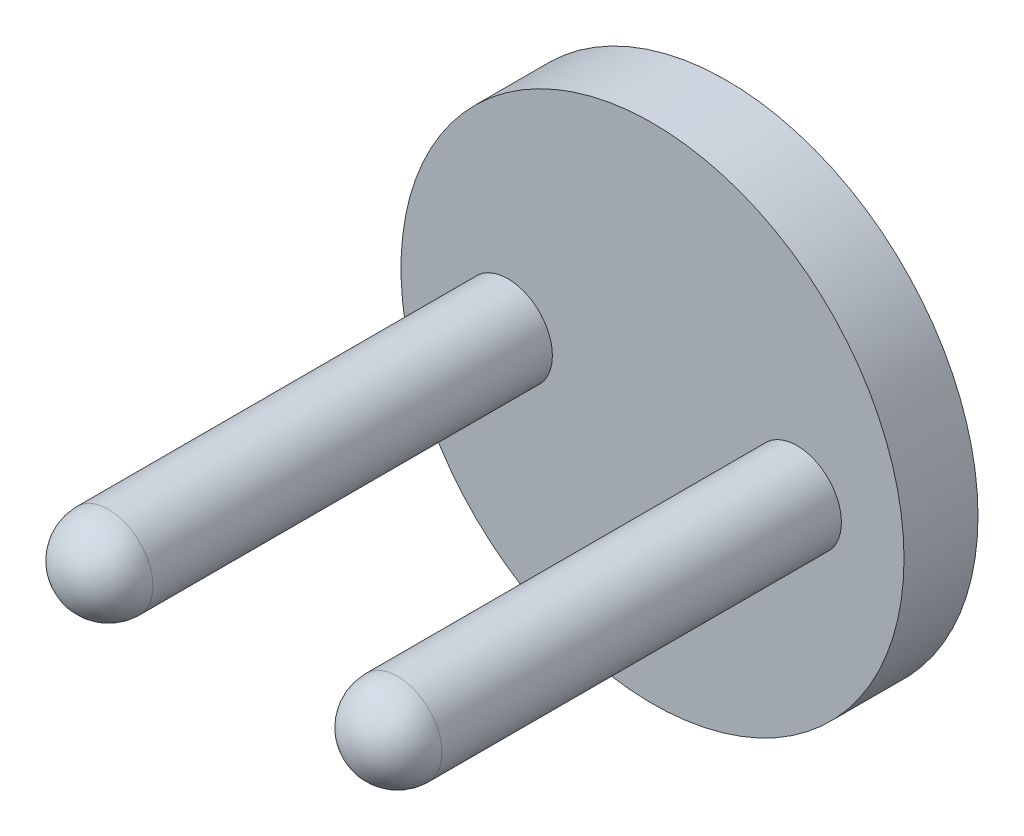
ISO-10303-21;
HEADER;
FILE_DESCRIPTION(('STEP AP214'),'2;1');
FILE_NAME('part.step','',(''),(''),'','','');
FILE_SCHEMA(('AUTOMOTIVE_DESIGN { 1 0 10303 214 1 1 1 1 }'));
ENDSEC;
DATA;
#1=APPLICATION_CONTEXT('core data for automotive mechanical design processes');
#2=APPLICATION_PROTOCOL_DEFINITION('international standard','automotive_design',2000,#1);
#3=PRODUCT_CONTEXT('',#1,'mechanical');
#4=PRODUCT('Part','Part','',(#3));
#5=PRODUCT_RELATED_PRODUCT_CATEGORY('part','',(#4));
#6=PRODUCT_DEFINITION_FORMATION('','',#4);
#7=PRODUCT_DEFINITION_CONTEXT('part definition',#1,'design');
#8=PRODUCT_DEFINITION('design','',#6,#7);
#9=PRODUCT_DEFINITION_SHAPE('','',#8);
#10=(LENGTH_UNIT() NAMED_UNIT(*) SI_UNIT(.MILLI.,.METRE.));
#11=(NAMED_UNIT(*) PLANE_ANGLE_UNIT() SI_UNIT($,.RADIAN.));
#12=(NAMED_UNIT(*) SI_UNIT($,.STERADIAN.) SOLID_ANGLE_UNIT());
#13=UNCERTAINTY_MEASURE_WITH_UNIT(LENGTH_MEASURE(1.E-05),#10,'distance_accuracy_value','');
#14=(GEOMETRIC_REPRESENTATION_CONTEXT(3) GLOBAL_UNCERTAINTY_ASSIGNED_CONTEXT((#13)) GLOBAL_UNIT_ASSIGNED_CONTEXT((#10,
#11,#12)) REPRESENTATION_CONTEXT('',''));
#15=CARTESIAN_POINT('',(0.,0.,0.));
#16=DIRECTION('',(0.,0.,1.));
#17=DIRECTION('',(1.,0.,0.));
#18=AXIS2_PLACEMENT_3D('',#15,#16,#17);
#19=CARTESIAN_POINT('',(0.,0.,5.));
#20=DIRECTION('',(0.,0.,-1.));
#21=DIRECTION('',(-1.,0.,0.));
#22=AXIS2_PLACEMENT_3D('',#19,#20,#21);
#23=CYLINDRICAL_SURFACE('',#22,17.);
#24=CARTESIAN_POINT('',(0.,0.,5.));
#25=DIRECTION('',(0.,0.,1.));
#26=DIRECTION('',(1.,0.,0.));
#27=AXIS2_PLACEMENT_3D('',#24,#25,#26);
#28=CIRCLE('',#27,17.);
#29=CARTESIAN_POINT('',(17.,0.,5.));
#30=VERTEX_POINT('',#29);
#31=EDGE_CURVE('E46',#30,#30,#28,.T.);
#32=ORIENTED_EDGE('',*,*,#31,.F.);
#33=EDGE_LOOP('',(#32));
#34=FACE_BOUND('',#33,.T.);
#35=CARTESIAN_POINT('',(0.,0.,0.));
#36=DIRECTION('',(0.,0.,1.));
#37=DIRECTION('',(1.,0.,0.));
#38=AXIS2_PLACEMENT_3D('',#35,#36,#37);
#39=CIRCLE('',#38,17.);
#40=CARTESIAN_POINT('',(17.,0.,0.));
#41=VERTEX_POINT('',#40);
#42=EDGE_CURVE('E49',#41,#41,#39,.T.);
#43=ORIENTED_EDGE('',*,*,#42,.T.);
#44=EDGE_LOOP('',(#43));
#45=FACE_BOUND('',#44,.T.);
#46=ADVANCED_FACE('F31',(#34,#45),#23,.T.);
#47=CARTESIAN_POINT('',(0.,0.,5.));
#48=DIRECTION('',(0.,0.,1.));
#49=DIRECTION('',(1.,0.,0.));
#50=AXIS2_PLACEMENT_3D('',#47,#48,#49);
#51=PLANE('',#50);
#52=CARTESIAN_POINT('',(9.76820771932768,0.,5.));
#53=DIRECTION('',(0.,0.,1.));
#54=DIRECTION('',(1.,0.,0.));
#55=AXIS2_PLACEMENT_3D('',#52,#53,#54);
#56=CIRCLE('',#55,3.);
#57=CARTESIAN_POINT('',(12.7682077193277,0.,5.));
#58=VERTEX_POINT('',#57);
#59=EDGE_CURVE('E57',#58,#58,#56,.T.);
#60=ORIENTED_EDGE('',*,*,#59,.F.);
#61=EDGE_LOOP('',(#60));
#62=FACE_BOUND('',#61,.T.);
#63=CARTESIAN_POINT('',(-9.76820771932768,0.,5.));
#64=DIRECTION('',(0.,0.,1.));
#65=DIRECTION('',(1.,0.,0.));
#66=AXIS2_PLACEMENT_3D('',#63,#64,#65);
#67=CIRCLE('',#66,3.);
#68=CARTESIAN_POINT('',(-6.76820771932768,0.,5.));
#69=VERTEX_POINT('',#68);
#70=EDGE_CURVE('E52',#69,#69,#67,.T.);
#71=ORIENTED_EDGE('',*,*,#70,.F.);
#72=EDGE_LOOP('',(#71));
#73=FACE_BOUND('',#72,.T.);
#74=ORIENTED_EDGE('',*,*,#31,.T.);
#75=EDGE_LOOP('',(#74));
#76=FACE_BOUND('',#75,.T.);
#77=ADVANCED_FACE('F77',(#62,#73,#76),#51,.T.);
#78=CARTESIAN_POINT('',(0.,0.,0.));
#79=DIRECTION('',(0.,0.,1.));
#80=DIRECTION('',(1.,0.,0.));
#81=AXIS2_PLACEMENT_3D('',#78,#79,#80);
#82=PLANE('',#81);
#83=CARTESIAN_POINT('',(0.,0.,0.));
#84=DIRECTION('',(0.,0.,-1.));
#85=DIRECTION('',(-1.,0.,0.));
#86=AXIS2_PLACEMENT_3D('',#83,#84,#85);
#87=CIRCLE('',#86,3.125);
#88=CARTESIAN_POINT('',(-3.125,0.,0.));
#89=VERTEX_POINT('',#88);
#90=EDGE_CURVE('E42',#89,#89,#87,.T.);
#91=ORIENTED_EDGE('',*,*,#90,.F.);
#92=EDGE_LOOP('',(#91));
#93=FACE_BOUND('',#92,.T.);
#94=ORIENTED_EDGE('',*,*,#42,.F.);
#95=EDGE_LOOP('',(#94));
#96=FACE_BOUND('',#95,.T.);
#97=ADVANCED_FACE('F73',(#93,#96),#82,.F.);
#98=CARTESIAN_POINT('',(-9.76820771932768,0.,35.));
#99=DIRECTION('',(0.,0.,-1.));
#100=DIRECTION('',(-1.,0.,0.));
#101=AXIS2_PLACEMENT_3D('',#98,#99,#100);
#102=CYLINDRICAL_SURFACE('',#101,3.);
#103=CARTESIAN_POINT('',(-9.76820771932768,0.,32.));
#104=DIRECTION('',(0.,0.,-1.));
#105=DIRECTION('',(-1.,0.,0.));
#106=AXIS2_PLACEMENT_3D('',#103,#104,#105);
#107=CIRCLE('',#106,3.);
#108=CARTESIAN_POINT('',(-12.7682077193277,0.,32.));
#109=VERTEX_POINT('',#108);
#110=EDGE_CURVE('E10',#109,#109,#107,.T.);
#111=ORIENTED_EDGE('',*,*,#110,.T.);
#112=EDGE_LOOP('',(#111));
#113=FACE_BOUND('',#112,.T.);
#114=ORIENTED_EDGE('',*,*,#70,.T.);
#115=EDGE_LOOP('',(#114));
#116=FACE_BOUND('',#115,.T.);
#117=ADVANCED_FACE('F76',(#113,#116),#102,.T.);
#118=CARTESIAN_POINT('',(9.76820771932768,0.,35.));
#119=DIRECTION('',(0.,0.,-1.));
#120=DIRECTION('',(-1.,0.,0.));
#121=AXIS2_PLACEMENT_3D('',#118,#119,#120);
#122=CYLINDRICAL_SURFACE('',#121,3.);
#123=CARTESIAN_POINT('',(9.76820771932768,0.,32.));
#124=DIRECTION('',(0.,0.,-1.));
#125=DIRECTION('',(-1.,0.,0.));
#126=AXIS2_PLACEMENT_3D('',#123,#124,#125);
#127=CIRCLE('',#126,3.);
#128=CARTESIAN_POINT('',(6.76820771932768,0.,32.));
#129=VERTEX_POINT('',#128);
#130=EDGE_CURVE('E38',#129,#129,#127,.T.);
#131=ORIENTED_EDGE('',*,*,#130,.T.);
#132=EDGE_LOOP('',(#131));
#133=FACE_BOUND('',#132,.T.);
#134=ORIENTED_EDGE('',*,*,#59,.T.);
#135=EDGE_LOOP('',(#134));
#136=FACE_BOUND('',#135,.T.);
#137=ADVANCED_FACE('F69',(#133,#136),#122,.T.);
#138=CARTESIAN_POINT('',(0.,0.,-4.));
#139=DIRECTION('',(0.,0.,1.));
#140=DIRECTION('',(1.,0.,0.));
#141=AXIS2_PLACEMENT_3D('',#138,#139,#140);
#142=CYLINDRICAL_SURFACE('',#141,3.125);
#143=CARTESIAN_POINT('',(0.,0.,-4.));
#144=DIRECTION('',(0.,0.,-1.));
#145=DIRECTION('',(-1.,0.,0.));
#146=AXIS2_PLACEMENT_3D('',#143,#144,#145);
#147=CIRCLE('',#146,3.125);
#148=CARTESIAN_POINT('',(-3.125,0.,-4.));
#149=VERTEX_POINT('',#148);
#150=EDGE_CURVE('E59',#149,#149,#147,.T.);
#151=ORIENTED_EDGE('',*,*,#150,.F.);
#152=EDGE_LOOP('',(#151));
#153=FACE_BOUND('',#152,.T.);
#154=ORIENTED_EDGE('',*,*,#90,.T.);
#155=EDGE_LOOP('',(#154));
#156=FACE_BOUND('',#155,.T.);
#157=ADVANCED_FACE('F66',(#153,#156),#142,.T.);
#158=CARTESIAN_POINT('',(0.,0.,-4.));
#159=DIRECTION('',(0.,0.,-1.));
#160=DIRECTION('',(-1.,0.,0.));
#161=AXIS2_PLACEMENT_3D('',#158,#159,#160);
#162=PLANE('',#161);
#163=ORIENTED_EDGE('',*,*,#150,.T.);
#164=EDGE_LOOP('',(#163));
#165=FACE_BOUND('',#164,.T.);
#166=ADVANCED_FACE('F64',(#165),#162,.T.);
#167=CARTESIAN_POINT('',(9.76820771932768,0.,32.));
#168=DIRECTION('',(0.,0.,1.));
#169=DIRECTION('',(1.,0.,0.));
#170=AXIS2_PLACEMENT_3D('',#167,#168,#169);
#171=SPHERICAL_SURFACE('',#170,3.);
#172=ORIENTED_EDGE('',*,*,#130,.F.);
#173=EDGE_LOOP('',(#172));
#174=FACE_BOUND('',#173,.T.);
#175=ADVANCED_FACE('F90',(#174),#171,.T.);
#176=CARTESIAN_POINT('',(-9.76820771932768,0.,32.));
#177=DIRECTION('',(0.,0.,1.));
#178=DIRECTION('',(1.,0.,0.));
#179=AXIS2_PLACEMENT_3D('',#176,#177,#178);
#180=SPHERICAL_SURFACE('',#179,3.);
#181=ORIENTED_EDGE('',*,*,#110,.F.);
#182=EDGE_LOOP('',(#181));
#183=FACE_BOUND('',#182,.T.);
#184=ADVANCED_FACE('F33',(#183),#180,.T.);
#185=CLOSED_SHELL('',(#46,#77,#97,#117,#137,#157,#166,#175,#184));
#186=MANIFOLD_SOLID_BREP('B2',#185);
#187=ADVANCED_BREP_SHAPE_REPRESENTATION('',(#18,#186),#14);
#188=SHAPE_DEFINITION_REPRESENTATION(#9,#187);
ENDSEC;
END-ISO-10303-21;
